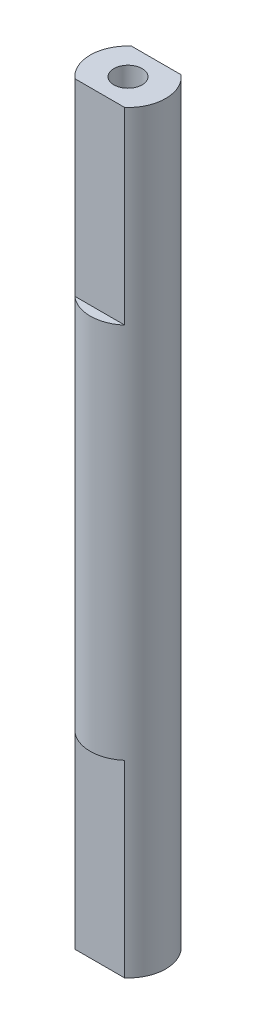
ISO-10303-21;
HEADER;
FILE_DESCRIPTION(('STEP AP214'),'2;1');
FILE_NAME('part.step','',(''),(''),'','','');
FILE_SCHEMA(('AUTOMOTIVE_DESIGN { 1 0 10303 214 1 1 1 1 }'));
ENDSEC;
DATA;
#1=APPLICATION_CONTEXT('core data for automotive mechanical design processes');
#2=APPLICATION_PROTOCOL_DEFINITION('international standard','automotive_design',2000,#1);
#3=PRODUCT_CONTEXT('',#1,'mechanical');
#4=PRODUCT('Part','Part','',(#3));
#5=PRODUCT_RELATED_PRODUCT_CATEGORY('part','',(#4));
#6=PRODUCT_DEFINITION_FORMATION('','',#4);
#7=PRODUCT_DEFINITION_CONTEXT('part definition',#1,'design');
#8=PRODUCT_DEFINITION('design','',#6,#7);
#9=PRODUCT_DEFINITION_SHAPE('','',#8);
#10=(LENGTH_UNIT() NAMED_UNIT(*) SI_UNIT(.MILLI.,.METRE.));
#11=(NAMED_UNIT(*) PLANE_ANGLE_UNIT() SI_UNIT($,.RADIAN.));
#12=(NAMED_UNIT(*) SI_UNIT($,.STERADIAN.) SOLID_ANGLE_UNIT());
#13=UNCERTAINTY_MEASURE_WITH_UNIT(LENGTH_MEASURE(1.E-05),#10,'distance_accuracy_value','');
#14=(GEOMETRIC_REPRESENTATION_CONTEXT(3) GLOBAL_UNCERTAINTY_ASSIGNED_CONTEXT((#13)) GLOBAL_UNIT_ASSIGNED_CONTEXT((#10,
#11,#12)) REPRESENTATION_CONTEXT('',''));
#15=CARTESIAN_POINT('',(0.,0.,0.));
#16=DIRECTION('',(0.,0.,1.));
#17=DIRECTION('',(1.,0.,0.));
#18=AXIS2_PLACEMENT_3D('',#15,#16,#17);
#19=CARTESIAN_POINT('',(0.,-10.,0.));
#20=DIRECTION('',(0.,1.,0.));
#21=DIRECTION('',(0.,0.,1.));
#22=AXIS2_PLACEMENT_3D('',#19,#20,#21);
#23=PLANE('',#22);
#24=CARTESIAN_POINT('',(0.,-10.,0.));
#25=DIRECTION('',(0.,1.,0.));
#26=DIRECTION('',(0.,0.,1.));
#27=AXIS2_PLACEMENT_3D('',#24,#25,#26);
#28=CIRCLE('',#27,2.);
#29=CARTESIAN_POINT('',(1.3228756555323,-10.,-1.5));
#30=VERTEX_POINT('',#29);
#31=CARTESIAN_POINT('',(-1.3228756555323,-10.,-1.5));
#32=VERTEX_POINT('',#31);
#33=EDGE_CURVE('E192',#30,#32,#28,.T.);
#34=ORIENTED_EDGE('',*,*,#33,.F.);
#35=DIRECTION('',(-1.,0.,0.));
#36=VECTOR('',#35,1.);
#37=CARTESIAN_POINT('',(1.3228756555323,-10.,-1.5));
#38=LINE('',#37,#36);
#39=EDGE_CURVE('E123',#30,#32,#38,.T.);
#40=ORIENTED_EDGE('',*,*,#39,.T.);
#41=EDGE_LOOP('',(#34,#40));
#42=FACE_BOUND('',#41,.T.);
#43=ADVANCED_FACE('F39',(#42),#23,.F.);
#44=CARTESIAN_POINT('',(0.,10.,0.));
#45=DIRECTION('',(0.,1.,0.));
#46=DIRECTION('',(0.,0.,1.));
#47=AXIS2_PLACEMENT_3D('',#44,#45,#46);
#48=PLANE('',#47);
#49=DIRECTION('',(1.,0.,0.));
#50=VECTOR('',#49,1.);
#51=CARTESIAN_POINT('',(1.3228756555323,10.,1.5));
#52=LINE('',#51,#50);
#53=CARTESIAN_POINT('',(-1.3228756555323,10.,1.5));
#54=VERTEX_POINT('',#53);
#55=CARTESIAN_POINT('',(1.3228756555323,10.,1.5));
#56=VERTEX_POINT('',#55);
#57=EDGE_CURVE('E63',#54,#56,#52,.T.);
#58=ORIENTED_EDGE('',*,*,#57,.F.);
#59=CARTESIAN_POINT('',(0.,10.,0.));
#60=DIRECTION('',(0.,1.,0.));
#61=DIRECTION('',(0.,0.,1.));
#62=AXIS2_PLACEMENT_3D('',#59,#60,#61);
#63=CIRCLE('',#62,2.);
#64=EDGE_CURVE('E49',#54,#56,#63,.T.);
#65=ORIENTED_EDGE('',*,*,#64,.T.);
#66=EDGE_LOOP('',(#58,#65));
#67=FACE_BOUND('',#66,.T.);
#68=ADVANCED_FACE('F213',(#67),#48,.T.);
#69=CARTESIAN_POINT('',(0.,10.,0.));
#70=DIRECTION('',(0.,-1.,0.));
#71=DIRECTION('',(0.,0.,-1.));
#72=AXIS2_PLACEMENT_3D('',#69,#70,#71);
#73=CYLINDRICAL_SURFACE('',#72,2.);
#74=CARTESIAN_POINT('',(1.3228756555323,10.,-1.5));
#75=VERTEX_POINT('',#74);
#76=CARTESIAN_POINT('',(-1.3228756555323,10.,-1.5));
#77=VERTEX_POINT('',#76);
#78=EDGE_CURVE('E11',#75,#77,#63,.T.);
#79=ORIENTED_EDGE('',*,*,#78,.F.);
#80=DIRECTION('',(0.,-1.,0.));
#81=VECTOR('',#80,1.);
#82=CARTESIAN_POINT('',(1.3228756555323,20.,-1.5));
#83=LINE('',#82,#81);
#84=CARTESIAN_POINT('',(1.3228756555323,20.,-1.5));
#85=VERTEX_POINT('',#84);
#86=EDGE_CURVE('E188',#85,#75,#83,.T.);
#87=ORIENTED_EDGE('',*,*,#86,.F.);
#88=CARTESIAN_POINT('',(0.,20.,0.));
#89=DIRECTION('',(0.,1.,0.));
#90=DIRECTION('',(0.,0.,1.));
#91=AXIS2_PLACEMENT_3D('',#88,#89,#90);
#92=CIRCLE('',#91,2.);
#93=CARTESIAN_POINT('',(1.3228756555323,20.,1.5));
#94=VERTEX_POINT('',#93);
#95=EDGE_CURVE('E158',#94,#85,#92,.T.);
#96=ORIENTED_EDGE('',*,*,#95,.F.);
#97=DIRECTION('',(0.,-1.,0.));
#98=VECTOR('',#97,1.);
#99=CARTESIAN_POINT('',(1.3228756555323,20.,1.5));
#100=LINE('',#99,#98);
#101=EDGE_CURVE('E171',#94,#56,#100,.T.);
#102=ORIENTED_EDGE('',*,*,#101,.T.);
#103=ORIENTED_EDGE('',*,*,#64,.F.);
#104=DIRECTION('',(0.,-1.,0.));
#105=VECTOR('',#104,1.);
#106=CARTESIAN_POINT('',(-1.3228756555323,20.,1.5));
#107=LINE('',#106,#105);
#108=CARTESIAN_POINT('',(-1.3228756555323,20.,1.5));
#109=VERTEX_POINT('',#108);
#110=EDGE_CURVE('E180',#109,#54,#107,.T.);
#111=ORIENTED_EDGE('',*,*,#110,.F.);
#112=CARTESIAN_POINT('',(0.,20.,0.));
#113=DIRECTION('',(0.,1.,0.));
#114=DIRECTION('',(0.,0.,1.));
#115=AXIS2_PLACEMENT_3D('',#112,#113,#114);
#116=CIRCLE('',#115,2.);
#117=CARTESIAN_POINT('',(-1.3228756555323,20.,-1.5));
#118=VERTEX_POINT('',#117);
#119=EDGE_CURVE('E165',#118,#109,#116,.T.);
#120=ORIENTED_EDGE('',*,*,#119,.F.);
#121=DIRECTION('',(0.,-1.,0.));
#122=VECTOR('',#121,1.);
#123=CARTESIAN_POINT('',(-1.3228756555323,20.,-1.5));
#124=LINE('',#123,#122);
#125=EDGE_CURVE('E184',#118,#77,#124,.T.);
#126=ORIENTED_EDGE('',*,*,#125,.T.);
#127=EDGE_LOOP('',(#79,#87,#96,#102,#103,#111,#120,#126));
#128=FACE_BOUND('',#127,.T.);
#129=CARTESIAN_POINT('',(-1.3228756555323,-10.,1.5));
#130=VERTEX_POINT('',#129);
#131=CARTESIAN_POINT('',(1.3228756555323,-10.,1.5));
#132=VERTEX_POINT('',#131);
#133=EDGE_CURVE('E43',#130,#132,#28,.T.);
#134=ORIENTED_EDGE('',*,*,#133,.T.);
#135=DIRECTION('',(0.,1.,0.));
#136=VECTOR('',#135,1.);
#137=CARTESIAN_POINT('',(1.3228756555323,-20.,1.5));
#138=LINE('',#137,#136);
#139=CARTESIAN_POINT('',(1.3228756555323,-20.,1.5));
#140=VERTEX_POINT('',#139);
#141=EDGE_CURVE('E56',#140,#132,#138,.T.);
#142=ORIENTED_EDGE('',*,*,#141,.F.);
#143=CARTESIAN_POINT('',(0.,-20.,0.));
#144=DIRECTION('',(0.,1.,0.));
#145=DIRECTION('',(0.,0.,1.));
#146=AXIS2_PLACEMENT_3D('',#143,#144,#145);
#147=CIRCLE('',#146,2.);
#148=CARTESIAN_POINT('',(1.3228756555323,-20.,-1.5));
#149=VERTEX_POINT('',#148);
#150=EDGE_CURVE('E107',#140,#149,#147,.T.);
#151=ORIENTED_EDGE('',*,*,#150,.T.);
#152=DIRECTION('',(0.,1.,0.));
#153=VECTOR('',#152,1.);
#154=CARTESIAN_POINT('',(1.3228756555323,-20.,-1.5));
#155=LINE('',#154,#153);
#156=EDGE_CURVE('E135',#149,#30,#155,.T.);
#157=ORIENTED_EDGE('',*,*,#156,.T.);
#158=ORIENTED_EDGE('',*,*,#33,.T.);
#159=DIRECTION('',(0.,1.,0.));
#160=VECTOR('',#159,1.);
#161=CARTESIAN_POINT('',(-1.3228756555323,-20.,-1.5));
#162=LINE('',#161,#160);
#163=CARTESIAN_POINT('',(-1.3228756555323,-20.,-1.5));
#164=VERTEX_POINT('',#163);
#165=EDGE_CURVE('E145',#164,#32,#162,.T.);
#166=ORIENTED_EDGE('',*,*,#165,.F.);
#167=CARTESIAN_POINT('',(0.,-20.,0.));
#168=DIRECTION('',(0.,1.,0.));
#169=DIRECTION('',(0.,0.,1.));
#170=AXIS2_PLACEMENT_3D('',#167,#168,#169);
#171=CIRCLE('',#170,2.);
#172=CARTESIAN_POINT('',(-1.3228756555323,-20.,1.5));
#173=VERTEX_POINT('',#172);
#174=EDGE_CURVE('E127',#164,#173,#171,.T.);
#175=ORIENTED_EDGE('',*,*,#174,.T.);
#176=DIRECTION('',(0.,1.,0.));
#177=VECTOR('',#176,1.);
#178=CARTESIAN_POINT('',(-1.3228756555323,-20.,1.5));
#179=LINE('',#178,#177);
#180=EDGE_CURVE('E112',#173,#130,#179,.T.);
#181=ORIENTED_EDGE('',*,*,#180,.T.);
#182=EDGE_LOOP('',(#134,#142,#151,#157,#158,#166,#175,#181));
#183=FACE_BOUND('',#182,.T.);
#184=ADVANCED_FACE('F41',(#128,#183),#73,.T.);
#185=DIRECTION('',(-1.,0.,0.));
#186=VECTOR('',#185,1.);
#187=CARTESIAN_POINT('',(1.3228756555323,10.,-1.5));
#188=LINE('',#187,#186);
#189=EDGE_CURVE('E154',#75,#77,#188,.T.);
#190=ORIENTED_EDGE('',*,*,#189,.F.);
#191=ORIENTED_EDGE('',*,*,#78,.T.);
#192=EDGE_LOOP('',(#190,#191));
#193=FACE_BOUND('',#192,.T.);
#194=ADVANCED_FACE('F219',(#193),#48,.T.);
#195=ORIENTED_EDGE('',*,*,#133,.F.);
#196=DIRECTION('',(1.,0.,0.));
#197=VECTOR('',#196,1.);
#198=CARTESIAN_POINT('',(1.3228756555323,-10.,1.5));
#199=LINE('',#198,#197);
#200=EDGE_CURVE('E136',#130,#132,#199,.T.);
#201=ORIENTED_EDGE('',*,*,#200,.T.);
#202=EDGE_LOOP('',(#195,#201));
#203=FACE_BOUND('',#202,.T.);
#204=ADVANCED_FACE('F214',(#203),#23,.F.);
#205=CARTESIAN_POINT('',(1.3228756555323,20.,-1.5));
#206=DIRECTION('',(0.,0.,1.));
#207=DIRECTION('',(1.,0.,0.));
#208=AXIS2_PLACEMENT_3D('',#205,#206,#207);
#209=PLANE('',#208);
#210=ORIENTED_EDGE('',*,*,#189,.T.);
#211=ORIENTED_EDGE('',*,*,#125,.F.);
#212=DIRECTION('',(-1.,0.,0.));
#213=VECTOR('',#212,1.);
#214=CARTESIAN_POINT('',(1.3228756555323,20.,-1.5));
#215=LINE('',#214,#213);
#216=EDGE_CURVE('E162',#85,#118,#215,.T.);
#217=ORIENTED_EDGE('',*,*,#216,.F.);
#218=ORIENTED_EDGE('',*,*,#86,.T.);
#219=EDGE_LOOP('',(#210,#211,#217,#218));
#220=FACE_BOUND('',#219,.T.);
#221=ADVANCED_FACE('F221',(#220),#209,.F.);
#222=CARTESIAN_POINT('',(1.3228756555323,20.,1.5));
#223=DIRECTION('',(0.,0.,-1.));
#224=DIRECTION('',(-1.,0.,0.));
#225=AXIS2_PLACEMENT_3D('',#222,#223,#224);
#226=PLANE('',#225);
#227=ORIENTED_EDGE('',*,*,#57,.T.);
#228=ORIENTED_EDGE('',*,*,#101,.F.);
#229=DIRECTION('',(1.,0.,0.));
#230=VECTOR('',#229,1.);
#231=CARTESIAN_POINT('',(1.3228756555323,20.,1.5));
#232=LINE('',#231,#230);
#233=EDGE_CURVE('E168',#109,#94,#232,.T.);
#234=ORIENTED_EDGE('',*,*,#233,.F.);
#235=ORIENTED_EDGE('',*,*,#110,.T.);
#236=EDGE_LOOP('',(#227,#228,#234,#235));
#237=FACE_BOUND('',#236,.T.);
#238=ADVANCED_FACE('F227',(#237),#226,.F.);
#239=CARTESIAN_POINT('',(0.,20.,0.));
#240=DIRECTION('',(0.,1.,0.));
#241=DIRECTION('',(0.,0.,1.));
#242=AXIS2_PLACEMENT_3D('',#239,#240,#241);
#243=PLANE('',#242);
#244=CARTESIAN_POINT('',(0.,20.,0.));
#245=DIRECTION('',(0.,1.,0.));
#246=DIRECTION('',(0.,0.,1.));
#247=AXIS2_PLACEMENT_3D('',#244,#245,#246);
#248=CIRCLE('',#247,0.75);
#249=CARTESIAN_POINT('',(0.,20.,0.75));
#250=VERTEX_POINT('',#249);
#251=EDGE_CURVE('E111',#250,#250,#248,.T.);
#252=ORIENTED_EDGE('',*,*,#251,.F.);
#253=EDGE_LOOP('',(#252));
#254=FACE_BOUND('',#253,.T.);
#255=ORIENTED_EDGE('',*,*,#95,.T.);
#256=ORIENTED_EDGE('',*,*,#216,.T.);
#257=ORIENTED_EDGE('',*,*,#119,.T.);
#258=ORIENTED_EDGE('',*,*,#233,.T.);
#259=EDGE_LOOP('',(#255,#256,#257,#258));
#260=FACE_BOUND('',#259,.T.);
#261=ADVANCED_FACE('F238',(#254,#260),#243,.T.);
#262=CARTESIAN_POINT('',(0.,12.,0.));
#263=DIRECTION('',(0.,1.,0.));
#264=DIRECTION('',(0.,0.,1.));
#265=AXIS2_PLACEMENT_3D('',#262,#263,#264);
#266=CYLINDRICAL_SURFACE('',#265,0.75);
#267=CARTESIAN_POINT('',(0.,12.,0.));
#268=DIRECTION('',(0.,1.,0.));
#269=DIRECTION('',(0.,0.,1.));
#270=AXIS2_PLACEMENT_3D('',#267,#268,#269);
#271=CIRCLE('',#270,0.75);
#272=CARTESIAN_POINT('',(0.,12.,0.75));
#273=VERTEX_POINT('',#272);
#274=EDGE_CURVE('E150',#273,#273,#271,.T.);
#275=ORIENTED_EDGE('',*,*,#274,.F.);
#276=EDGE_LOOP('',(#275));
#277=FACE_BOUND('',#276,.T.);
#278=ORIENTED_EDGE('',*,*,#251,.T.);
#279=EDGE_LOOP('',(#278));
#280=FACE_BOUND('',#279,.T.);
#281=ADVANCED_FACE('F242',(#277,#280),#266,.F.);
#282=CARTESIAN_POINT('',(0.,12.,0.));
#283=DIRECTION('',(0.,1.,0.));
#284=DIRECTION('',(0.,0.,1.));
#285=AXIS2_PLACEMENT_3D('',#282,#283,#284);
#286=PLANE('',#285);
#287=ORIENTED_EDGE('',*,*,#274,.T.);
#288=EDGE_LOOP('',(#287));
#289=FACE_BOUND('',#288,.T.);
#290=ADVANCED_FACE('F210',(#289),#286,.T.);
#291=CARTESIAN_POINT('',(1.3228756555323,-20.,1.5));
#292=DIRECTION('',(0.,0.,1.));
#293=DIRECTION('',(1.,0.,0.));
#294=AXIS2_PLACEMENT_3D('',#291,#292,#293);
#295=PLANE('',#294);
#296=ORIENTED_EDGE('',*,*,#200,.F.);
#297=ORIENTED_EDGE('',*,*,#180,.F.);
#298=DIRECTION('',(1.,0.,0.));
#299=VECTOR('',#298,1.);
#300=CARTESIAN_POINT('',(1.3228756555323,-20.,1.5));
#301=LINE('',#300,#299);
#302=EDGE_CURVE('E118',#173,#140,#301,.T.);
#303=ORIENTED_EDGE('',*,*,#302,.T.);
#304=ORIENTED_EDGE('',*,*,#141,.T.);
#305=EDGE_LOOP('',(#296,#297,#303,#304));
#306=FACE_BOUND('',#305,.T.);
#307=ADVANCED_FACE('F125',(#306),#295,.T.);
#308=CARTESIAN_POINT('',(1.3228756555323,-20.,-1.5));
#309=DIRECTION('',(0.,0.,-1.));
#310=DIRECTION('',(-1.,0.,0.));
#311=AXIS2_PLACEMENT_3D('',#308,#309,#310);
#312=PLANE('',#311);
#313=ORIENTED_EDGE('',*,*,#39,.F.);
#314=ORIENTED_EDGE('',*,*,#156,.F.);
#315=DIRECTION('',(-1.,0.,0.));
#316=VECTOR('',#315,1.);
#317=CARTESIAN_POINT('',(1.3228756555323,-20.,-1.5));
#318=LINE('',#317,#316);
#319=EDGE_CURVE('E121',#149,#164,#318,.T.);
#320=ORIENTED_EDGE('',*,*,#319,.T.);
#321=ORIENTED_EDGE('',*,*,#165,.T.);
#322=EDGE_LOOP('',(#313,#314,#320,#321));
#323=FACE_BOUND('',#322,.T.);
#324=ADVANCED_FACE('F200',(#323),#312,.T.);
#325=CARTESIAN_POINT('',(0.,-20.,0.));
#326=DIRECTION('',(0.,-1.,0.));
#327=DIRECTION('',(0.,0.,1.));
#328=AXIS2_PLACEMENT_3D('',#325,#326,#327);
#329=PLANE('',#328);
#330=CARTESIAN_POINT('',(0.,-20.,0.));
#331=DIRECTION('',(0.,1.,0.));
#332=DIRECTION('',(0.,0.,1.));
#333=AXIS2_PLACEMENT_3D('',#330,#331,#332);
#334=CIRCLE('',#333,0.75);
#335=CARTESIAN_POINT('',(0.,-20.,0.75));
#336=VERTEX_POINT('',#335);
#337=EDGE_CURVE('E309',#336,#336,#334,.T.);
#338=ORIENTED_EDGE('',*,*,#337,.T.);
#339=EDGE_LOOP('',(#338));
#340=FACE_BOUND('',#339,.T.);
#341=ORIENTED_EDGE('',*,*,#150,.F.);
#342=ORIENTED_EDGE('',*,*,#302,.F.);
#343=ORIENTED_EDGE('',*,*,#174,.F.);
#344=ORIENTED_EDGE('',*,*,#319,.F.);
#345=EDGE_LOOP('',(#341,#342,#343,#344));
#346=FACE_BOUND('',#345,.T.);
#347=ADVANCED_FACE('F116',(#340,#346),#329,.T.);
#348=CARTESIAN_POINT('',(0.,-12.,0.));
#349=DIRECTION('',(0.,-1.,0.));
#350=DIRECTION('',(0.,0.,-1.));
#351=AXIS2_PLACEMENT_3D('',#348,#349,#350);
#352=CYLINDRICAL_SURFACE('',#351,0.75);
#353=CARTESIAN_POINT('',(0.,-12.,0.));
#354=DIRECTION('',(0.,1.,0.));
#355=DIRECTION('',(0.,0.,1.));
#356=AXIS2_PLACEMENT_3D('',#353,#354,#355);
#357=CIRCLE('',#356,0.75);
#358=CARTESIAN_POINT('',(0.,-12.,0.75));
#359=VERTEX_POINT('',#358);
#360=EDGE_CURVE('E139',#359,#359,#357,.T.);
#361=ORIENTED_EDGE('',*,*,#360,.T.);
#362=EDGE_LOOP('',(#361));
#363=FACE_BOUND('',#362,.T.);
#364=ORIENTED_EDGE('',*,*,#337,.F.);
#365=EDGE_LOOP('',(#364));
#366=FACE_BOUND('',#365,.T.);
#367=ADVANCED_FACE('F207',(#363,#366),#352,.F.);
#368=CARTESIAN_POINT('',(0.,-12.,0.));
#369=DIRECTION('',(0.,-1.,0.));
#370=DIRECTION('',(0.,0.,1.));
#371=AXIS2_PLACEMENT_3D('',#368,#369,#370);
#372=PLANE('',#371);
#373=ORIENTED_EDGE('',*,*,#360,.F.);
#374=EDGE_LOOP('',(#373));
#375=FACE_BOUND('',#374,.T.);
#376=ADVANCED_FACE('F292',(#375),#372,.T.);
#377=CLOSED_SHELL('',(#43,#68,#184,#194,#204,#221,#238,#261,#281,#290,#307,#324,#347,#367,#376));
#378=MANIFOLD_SOLID_BREP('B2',#377);
#379=ADVANCED_BREP_SHAPE_REPRESENTATION('',(#18,#378),#14);
#380=SHAPE_DEFINITION_REPRESENTATION(#9,#379);
ENDSEC;
END-ISO-10303-21;
